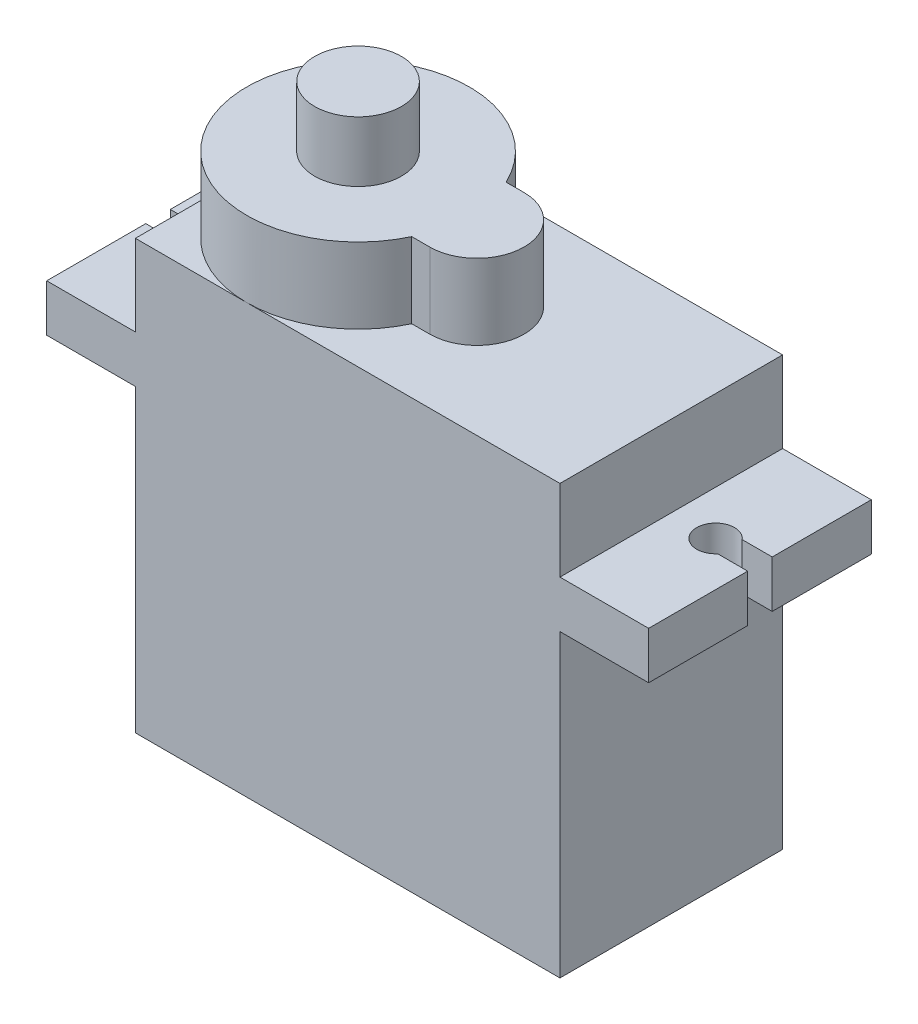
ISO-10303-21;
HEADER;
FILE_DESCRIPTION(('STEP AP214'),'2;1');
FILE_NAME('part.step','',(''),(''),'','','');
FILE_SCHEMA(('AUTOMOTIVE_DESIGN { 1 0 10303 214 1 1 1 1 }'));
ENDSEC;
DATA;
#1=APPLICATION_CONTEXT('core data for automotive mechanical design processes');
#2=APPLICATION_PROTOCOL_DEFINITION('international standard','automotive_design',2000,#1);
#3=PRODUCT_CONTEXT('',#1,'mechanical');
#4=PRODUCT('Part','Part','',(#3));
#5=PRODUCT_RELATED_PRODUCT_CATEGORY('part','',(#4));
#6=PRODUCT_DEFINITION_FORMATION('','',#4);
#7=PRODUCT_DEFINITION_CONTEXT('part definition',#1,'design');
#8=PRODUCT_DEFINITION('design','',#6,#7);
#9=PRODUCT_DEFINITION_SHAPE('','',#8);
#10=(LENGTH_UNIT() NAMED_UNIT(*) SI_UNIT(.MILLI.,.METRE.));
#11=(NAMED_UNIT(*) PLANE_ANGLE_UNIT() SI_UNIT($,.RADIAN.));
#12=(NAMED_UNIT(*) SI_UNIT($,.STERADIAN.) SOLID_ANGLE_UNIT());
#13=UNCERTAINTY_MEASURE_WITH_UNIT(LENGTH_MEASURE(1.E-05),#10,'distance_accuracy_value','');
#14=(GEOMETRIC_REPRESENTATION_CONTEXT(3) GLOBAL_UNCERTAINTY_ASSIGNED_CONTEXT((#13)) GLOBAL_UNIT_ASSIGNED_CONTEXT((#10,
#11,#12)) REPRESENTATION_CONTEXT('',''));
#15=CARTESIAN_POINT('',(0.,0.,0.));
#16=DIRECTION('',(0.,0.,1.));
#17=DIRECTION('',(1.,0.,0.));
#18=AXIS2_PLACEMENT_3D('',#15,#16,#17);
#19=CARTESIAN_POINT('',(5.9,29.9,5.9));
#20=DIRECTION('',(0.,-1.,0.));
#21=DIRECTION('',(0.,0.,-1.));
#22=AXIS2_PLACEMENT_3D('',#19,#20,#21);
#23=CYLINDRICAL_SURFACE('',#22,2.3);
#24=CARTESIAN_POINT('',(5.9,29.9,5.9));
#25=DIRECTION('',(0.,1.,0.));
#26=DIRECTION('',(0.,0.,1.));
#27=AXIS2_PLACEMENT_3D('',#24,#25,#26);
#28=CIRCLE('',#27,2.3);
#29=CARTESIAN_POINT('',(5.9,29.9,8.2));
#30=VERTEX_POINT('',#29);
#31=EDGE_CURVE('E11',#30,#30,#28,.T.);
#32=ORIENTED_EDGE('',*,*,#31,.F.);
#33=EDGE_LOOP('',(#32));
#34=FACE_BOUND('',#33,.T.);
#35=CARTESIAN_POINT('',(5.9,26.7,5.9));
#36=DIRECTION('',(0.,1.,0.));
#37=DIRECTION('',(0.,0.,1.));
#38=AXIS2_PLACEMENT_3D('',#35,#36,#37);
#39=CIRCLE('',#38,2.3);
#40=CARTESIAN_POINT('',(5.9,26.7,8.2));
#41=VERTEX_POINT('',#40);
#42=EDGE_CURVE('E50',#41,#41,#39,.T.);
#43=ORIENTED_EDGE('',*,*,#42,.T.);
#44=EDGE_LOOP('',(#43));
#45=FACE_BOUND('',#44,.T.);
#46=ADVANCED_FACE('F47',(#34,#45),#23,.T.);
#47=CARTESIAN_POINT('',(5.9,29.9,5.9));
#48=DIRECTION('',(0.,1.,0.));
#49=DIRECTION('',(0.,0.,1.));
#50=AXIS2_PLACEMENT_3D('',#47,#48,#49);
#51=PLANE('',#50);
#52=ORIENTED_EDGE('',*,*,#31,.T.);
#53=EDGE_LOOP('',(#52));
#54=FACE_BOUND('',#53,.T.);
#55=ADVANCED_FACE('F62',(#54),#51,.T.);
#56=CARTESIAN_POINT('',(5.9,26.7,5.9));
#57=DIRECTION('',(0.,1.,0.));
#58=DIRECTION('',(0.,0.,1.));
#59=AXIS2_PLACEMENT_3D('',#56,#57,#58);
#60=PLANE('',#59);
#61=ORIENTED_EDGE('',*,*,#42,.F.);
#62=EDGE_LOOP('',(#61));
#63=FACE_BOUND('',#62,.T.);
#64=ADVANCED_FACE('F60',(#63),#60,.F.);
#65=CLOSED_SHELL('',(#46,#55,#64));
#66=MANIFOLD_SOLID_BREP('B2',#65);
#67=CARTESIAN_POINT('',(22.5,15.9,11.8));
#68=DIRECTION('',(0.,1.,0.));
#69=DIRECTION('',(-1.,0.,0.));
#70=AXIS2_PLACEMENT_3D('',#67,#68,#69);
#71=PLANE('',#70);
#72=DIRECTION('',(1.,0.,0.));
#73=VECTOR('',#72,1.);
#74=CARTESIAN_POINT('',(22.5,15.9,5.25));
#75=LINE('',#74,#73);
#76=CARTESIAN_POINT('',(25.6099342076785,15.9,5.25));
#77=VERTEX_POINT('',#76);
#78=CARTESIAN_POINT('',(27.2,15.9,5.25));
#79=VERTEX_POINT('',#78);
#80=EDGE_CURVE('E505',#77,#79,#75,.T.);
#81=ORIENTED_EDGE('',*,*,#80,.F.);
#82=CARTESIAN_POINT('',(24.85,15.9,5.9));
#83=DIRECTION('',(0.,1.,0.));
#84=DIRECTION('',(-1.,0.,0.));
#85=AXIS2_PLACEMENT_3D('',#82,#83,#84);
#86=CIRCLE('',#85,1.);
#87=CARTESIAN_POINT('',(25.6099342076785,15.9,6.55));
#88=VERTEX_POINT('',#87);
#89=EDGE_CURVE('E504',#88,#77,#86,.F.);
#90=ORIENTED_EDGE('',*,*,#89,.F.);
#91=DIRECTION('',(-1.,0.,0.));
#92=VECTOR('',#91,1.);
#93=CARTESIAN_POINT('',(22.5,15.9,6.55));
#94=LINE('',#93,#92);
#95=CARTESIAN_POINT('',(27.2,15.9,6.55));
#96=VERTEX_POINT('',#95);
#97=EDGE_CURVE('E503',#96,#88,#94,.T.);
#98=ORIENTED_EDGE('',*,*,#97,.F.);
#99=DIRECTION('',(0.,0.,-1.));
#100=VECTOR('',#99,1.);
#101=CARTESIAN_POINT('',(27.2,15.9,11.8));
#102=LINE('',#101,#100);
#103=CARTESIAN_POINT('',(27.2,15.9,11.8));
#104=VERTEX_POINT('',#103);
#105=EDGE_CURVE('E282',#104,#96,#102,.T.);
#106=ORIENTED_EDGE('',*,*,#105,.F.);
#107=DIRECTION('',(1.,0.,0.));
#108=VECTOR('',#107,1.);
#109=CARTESIAN_POINT('',(22.5,15.9,11.8));
#110=LINE('',#109,#108);
#111=CARTESIAN_POINT('',(22.5,15.9,11.8));
#112=VERTEX_POINT('',#111);
#113=EDGE_CURVE('E384',#112,#104,#110,.T.);
#114=ORIENTED_EDGE('',*,*,#113,.F.);
#115=DIRECTION('',(0.,0.,-1.));
#116=VECTOR('',#115,1.);
#117=CARTESIAN_POINT('',(22.5,15.9,11.8));
#118=LINE('',#117,#116);
#119=CARTESIAN_POINT('',(22.5,15.9,0.));
#120=VERTEX_POINT('',#119);
#121=EDGE_CURVE('E297',#112,#120,#118,.T.);
#122=ORIENTED_EDGE('',*,*,#121,.T.);
#123=DIRECTION('',(1.,0.,0.));
#124=VECTOR('',#123,1.);
#125=CARTESIAN_POINT('',(22.5,15.9,0.));
#126=LINE('',#125,#124);
#127=CARTESIAN_POINT('',(27.2,15.9,0.));
#128=VERTEX_POINT('',#127);
#129=EDGE_CURVE('E410',#120,#128,#126,.T.);
#130=ORIENTED_EDGE('',*,*,#129,.T.);
#131=EDGE_CURVE('E289',#79,#128,#102,.T.);
#132=ORIENTED_EDGE('',*,*,#131,.F.);
#133=EDGE_LOOP('',(#81,#90,#98,#106,#114,#122,#130,#132));
#134=FACE_BOUND('',#133,.T.);
#135=ADVANCED_FACE('F94',(#134),#71,.F.);
#136=CARTESIAN_POINT('',(27.2,15.9,11.8));
#137=DIRECTION('',(-1.,0.,0.));
#138=DIRECTION('',(0.,-1.,0.));
#139=AXIS2_PLACEMENT_3D('',#136,#137,#138);
#140=PLANE('',#139);
#141=DIRECTION('',(0.,1.,0.));
#142=VECTOR('',#141,1.);
#143=CARTESIAN_POINT('',(27.2,14.4,5.25));
#144=LINE('',#143,#142);
#145=CARTESIAN_POINT('',(27.2,18.4,5.25));
#146=VERTEX_POINT('',#145);
#147=EDGE_CURVE('E283',#79,#146,#144,.T.);
#148=ORIENTED_EDGE('',*,*,#147,.F.);
#149=ORIENTED_EDGE('',*,*,#131,.T.);
#150=DIRECTION('',(0.,1.,0.));
#151=VECTOR('',#150,1.);
#152=CARTESIAN_POINT('',(27.2,15.9,0.));
#153=LINE('',#152,#151);
#154=CARTESIAN_POINT('',(27.2,18.4,0.));
#155=VERTEX_POINT('',#154);
#156=EDGE_CURVE('E413',#128,#155,#153,.T.);
#157=ORIENTED_EDGE('',*,*,#156,.T.);
#158=DIRECTION('',(0.,0.,-1.));
#159=VECTOR('',#158,1.);
#160=CARTESIAN_POINT('',(27.2,18.4,11.8));
#161=LINE('',#160,#159);
#162=EDGE_CURVE('E290',#146,#155,#161,.T.);
#163=ORIENTED_EDGE('',*,*,#162,.F.);
#164=EDGE_LOOP('',(#148,#149,#157,#163));
#165=FACE_BOUND('',#164,.T.);
#166=ADVANCED_FACE('F553',(#165),#140,.F.);
#167=DIRECTION('',(0.,1.,0.));
#168=VECTOR('',#167,1.);
#169=CARTESIAN_POINT('',(27.2,14.4,6.55));
#170=LINE('',#169,#168);
#171=CARTESIAN_POINT('',(27.2,18.4,6.55));
#172=VERTEX_POINT('',#171);
#173=EDGE_CURVE('E267',#96,#172,#170,.T.);
#174=ORIENTED_EDGE('',*,*,#173,.T.);
#175=CARTESIAN_POINT('',(27.2,18.4,11.8));
#176=VERTEX_POINT('',#175);
#177=EDGE_CURVE('E279',#176,#172,#161,.T.);
#178=ORIENTED_EDGE('',*,*,#177,.F.);
#179=DIRECTION('',(0.,1.,0.));
#180=VECTOR('',#179,1.);
#181=CARTESIAN_POINT('',(27.2,15.9,11.8));
#182=LINE('',#181,#180);
#183=EDGE_CURVE('E386',#104,#176,#182,.T.);
#184=ORIENTED_EDGE('',*,*,#183,.F.);
#185=ORIENTED_EDGE('',*,*,#105,.T.);
#186=EDGE_LOOP('',(#174,#178,#184,#185));
#187=FACE_BOUND('',#186,.T.);
#188=ADVANCED_FACE('F277',(#187),#140,.F.);
#189=CARTESIAN_POINT('',(22.5,18.4,11.8));
#190=DIRECTION('',(0.,-1.,0.));
#191=DIRECTION('',(0.,0.,-1.));
#192=AXIS2_PLACEMENT_3D('',#189,#190,#191);
#193=PLANE('',#192);
#194=DIRECTION('',(1.,0.,0.));
#195=VECTOR('',#194,1.);
#196=CARTESIAN_POINT('',(27.2,18.4,5.25));
#197=LINE('',#196,#195);
#198=CARTESIAN_POINT('',(25.6099342076785,18.4,5.25));
#199=VERTEX_POINT('',#198);
#200=EDGE_CURVE('E272',#199,#146,#197,.T.);
#201=ORIENTED_EDGE('',*,*,#200,.T.);
#202=ORIENTED_EDGE('',*,*,#162,.T.);
#203=DIRECTION('',(-1.,0.,0.));
#204=VECTOR('',#203,1.);
#205=CARTESIAN_POINT('',(22.5,18.4,0.));
#206=LINE('',#205,#204);
#207=CARTESIAN_POINT('',(22.5,18.4,0.));
#208=VERTEX_POINT('',#207);
#209=EDGE_CURVE('E416',#155,#208,#206,.T.);
#210=ORIENTED_EDGE('',*,*,#209,.T.);
#211=DIRECTION('',(0.,0.,-1.));
#212=VECTOR('',#211,1.);
#213=CARTESIAN_POINT('',(22.5,18.4,11.8));
#214=LINE('',#213,#212);
#215=CARTESIAN_POINT('',(22.5,18.4,11.8));
#216=VERTEX_POINT('',#215);
#217=EDGE_CURVE('E293',#216,#208,#214,.T.);
#218=ORIENTED_EDGE('',*,*,#217,.F.);
#219=DIRECTION('',(-1.,0.,0.));
#220=VECTOR('',#219,1.);
#221=CARTESIAN_POINT('',(22.5,18.4,11.8));
#222=LINE('',#221,#220);
#223=EDGE_CURVE('E288',#176,#216,#222,.T.);
#224=ORIENTED_EDGE('',*,*,#223,.F.);
#225=ORIENTED_EDGE('',*,*,#177,.T.);
#226=DIRECTION('',(-1.,0.,0.));
#227=VECTOR('',#226,1.);
#228=CARTESIAN_POINT('',(27.2,18.4,6.55));
#229=LINE('',#228,#227);
#230=CARTESIAN_POINT('',(25.6099342076785,18.4,6.55));
#231=VERTEX_POINT('',#230);
#232=EDGE_CURVE('E264',#172,#231,#229,.T.);
#233=ORIENTED_EDGE('',*,*,#232,.T.);
#234=CARTESIAN_POINT('',(24.85,18.4,5.9));
#235=DIRECTION('',(0.,-1.,0.));
#236=DIRECTION('',(0.,0.,1.));
#237=AXIS2_PLACEMENT_3D('',#234,#235,#236);
#238=CIRCLE('',#237,1.);
#239=EDGE_CURVE('E109',#231,#199,#238,.T.);
#240=ORIENTED_EDGE('',*,*,#239,.T.);
#241=EDGE_LOOP('',(#201,#202,#210,#218,#224,#225,#233,#240));
#242=FACE_BOUND('',#241,.T.);
#243=ADVANCED_FACE('F286',(#242),#193,.F.);
#244=CARTESIAN_POINT('',(-4.7,15.9,11.8));
#245=DIRECTION('',(1.,0.,0.));
#246=DIRECTION('',(0.,0.,-1.));
#247=AXIS2_PLACEMENT_3D('',#244,#245,#246);
#248=PLANE('',#247);
#249=DIRECTION('',(0.,0.,-1.));
#250=VECTOR('',#249,1.);
#251=CARTESIAN_POINT('',(-4.7,18.4,11.8));
#252=LINE('',#251,#250);
#253=CARTESIAN_POINT('',(-4.7,18.4,11.8));
#254=VERTEX_POINT('',#253);
#255=CARTESIAN_POINT('',(-4.7,18.4,6.55));
#256=VERTEX_POINT('',#255);
#257=EDGE_CURVE('E439',#254,#256,#252,.T.);
#258=ORIENTED_EDGE('',*,*,#257,.T.);
#259=DIRECTION('',(0.,1.,0.));
#260=VECTOR('',#259,1.);
#261=CARTESIAN_POINT('',(-4.7,14.4,6.55));
#262=LINE('',#261,#260);
#263=CARTESIAN_POINT('',(-4.7,15.9,6.55));
#264=VERTEX_POINT('',#263);
#265=EDGE_CURVE('E329',#264,#256,#262,.T.);
#266=ORIENTED_EDGE('',*,*,#265,.F.);
#267=DIRECTION('',(0.,0.,-1.));
#268=VECTOR('',#267,1.);
#269=CARTESIAN_POINT('',(-4.7,15.9,11.8));
#270=LINE('',#269,#268);
#271=CARTESIAN_POINT('',(-4.7,15.9,11.8));
#272=VERTEX_POINT('',#271);
#273=EDGE_CURVE('E436',#272,#264,#270,.T.);
#274=ORIENTED_EDGE('',*,*,#273,.F.);
#275=DIRECTION('',(0.,-1.,0.));
#276=VECTOR('',#275,1.);
#277=CARTESIAN_POINT('',(-4.7,15.9,11.8));
#278=LINE('',#277,#276);
#279=EDGE_CURVE('E399',#254,#272,#278,.T.);
#280=ORIENTED_EDGE('',*,*,#279,.F.);
#281=EDGE_LOOP('',(#258,#266,#274,#280));
#282=FACE_BOUND('',#281,.T.);
#283=ADVANCED_FACE('F536',(#282),#248,.F.);
#284=CARTESIAN_POINT('',(0.,22.7,11.8));
#285=DIRECTION('',(0.,-1.,0.));
#286=DIRECTION('',(0.,0.,-1.));
#287=AXIS2_PLACEMENT_3D('',#284,#285,#286);
#288=PLANE('',#287);
#289=CARTESIAN_POINT('',(5.9,22.7,5.9));
#290=DIRECTION('',(0.,1.,0.));
#291=DIRECTION('',(0.,0.,1.));
#292=AXIS2_PLACEMENT_3D('',#289,#290,#291);
#293=CIRCLE('',#292,5.9);
#294=CARTESIAN_POINT('',(0.,22.7,5.9));
#295=VERTEX_POINT('',#294);
#296=CARTESIAN_POINT('',(5.9,22.7,11.8));
#297=VERTEX_POINT('',#296);
#298=EDGE_CURVE('E308',#295,#297,#293,.T.);
#299=ORIENTED_EDGE('',*,*,#298,.F.);
#300=DIRECTION('',(0.,0.,-1.));
#301=VECTOR('',#300,1.);
#302=CARTESIAN_POINT('',(0.,22.7,11.8));
#303=LINE('',#302,#301);
#304=CARTESIAN_POINT('',(0.,22.7,11.8));
#305=VERTEX_POINT('',#304);
#306=EDGE_CURVE('E446',#305,#295,#303,.T.);
#307=ORIENTED_EDGE('',*,*,#306,.F.);
#308=DIRECTION('',(-1.,0.,0.));
#309=VECTOR('',#308,1.);
#310=CARTESIAN_POINT('',(0.,22.7,11.8));
#311=LINE('',#310,#309);
#312=EDGE_CURVE('E391',#297,#305,#311,.T.);
#313=ORIENTED_EDGE('',*,*,#312,.F.);
#314=EDGE_LOOP('',(#299,#307,#313));
#315=FACE_BOUND('',#314,.T.);
#316=ADVANCED_FACE('F492',(#315),#288,.F.);
#317=CARTESIAN_POINT('',(11.244155686355,22.7,8.4));
#318=VERTEX_POINT('',#317);
#319=EDGE_CURVE('E488',#297,#318,#293,.T.);
#320=ORIENTED_EDGE('',*,*,#319,.F.);
#321=CARTESIAN_POINT('',(22.5,22.7,11.8));
#322=VERTEX_POINT('',#321);
#323=EDGE_CURVE('E392',#322,#297,#311,.T.);
#324=ORIENTED_EDGE('',*,*,#323,.F.);
#325=DIRECTION('',(0.,0.,-1.));
#326=VECTOR('',#325,1.);
#327=CARTESIAN_POINT('',(22.5,22.7,11.8));
#328=LINE('',#327,#326);
#329=CARTESIAN_POINT('',(22.5,22.7,0.));
#330=VERTEX_POINT('',#329);
#331=EDGE_CURVE('E448',#322,#330,#328,.T.);
#332=ORIENTED_EDGE('',*,*,#331,.T.);
#333=DIRECTION('',(-1.,0.,0.));
#334=VECTOR('',#333,1.);
#335=CARTESIAN_POINT('',(0.,22.7,0.));
#336=LINE('',#335,#334);
#337=CARTESIAN_POINT('',(5.9,22.7,0.));
#338=VERTEX_POINT('',#337);
#339=EDGE_CURVE('E421',#330,#338,#336,.T.);
#340=ORIENTED_EDGE('',*,*,#339,.T.);
#341=CARTESIAN_POINT('',(11.244155686355,22.7,3.4));
#342=VERTEX_POINT('',#341);
#343=EDGE_CURVE('E359',#342,#338,#293,.T.);
#344=ORIENTED_EDGE('',*,*,#343,.F.);
#345=DIRECTION('',(-1.,0.,0.));
#346=VECTOR('',#345,1.);
#347=CARTESIAN_POINT('',(12.2,22.7,3.4));
#348=LINE('',#347,#346);
#349=CARTESIAN_POINT('',(12.2,22.7,3.4));
#350=VERTEX_POINT('',#349);
#351=EDGE_CURVE('E356',#350,#342,#348,.T.);
#352=ORIENTED_EDGE('',*,*,#351,.F.);
#353=CARTESIAN_POINT('',(12.2,22.7,5.9));
#354=DIRECTION('',(0.,1.,0.));
#355=DIRECTION('',(0.,0.,1.));
#356=AXIS2_PLACEMENT_3D('',#353,#354,#355);
#357=CIRCLE('',#356,2.5);
#358=CARTESIAN_POINT('',(12.2,22.7,8.4));
#359=VERTEX_POINT('',#358);
#360=EDGE_CURVE('E341',#359,#350,#357,.T.);
#361=ORIENTED_EDGE('',*,*,#360,.F.);
#362=DIRECTION('',(1.,0.,0.));
#363=VECTOR('',#362,1.);
#364=CARTESIAN_POINT('',(12.2,22.7,8.4));
#365=LINE('',#364,#363);
#366=EDGE_CURVE('E347',#318,#359,#365,.T.);
#367=ORIENTED_EDGE('',*,*,#366,.F.);
#368=EDGE_LOOP('',(#320,#324,#332,#340,#344,#352,#361,#367));
#369=FACE_BOUND('',#368,.T.);
#370=ADVANCED_FACE('F467',(#369),#288,.F.);
#371=EDGE_CURVE('E306',#338,#295,#293,.T.);
#372=ORIENTED_EDGE('',*,*,#371,.F.);
#373=CARTESIAN_POINT('',(0.,22.7,0.));
#374=VERTEX_POINT('',#373);
#375=EDGE_CURVE('E420',#338,#374,#336,.T.);
#376=ORIENTED_EDGE('',*,*,#375,.T.);
#377=EDGE_CURVE('E445',#295,#374,#303,.T.);
#378=ORIENTED_EDGE('',*,*,#377,.F.);
#379=EDGE_LOOP('',(#372,#376,#378));
#380=FACE_BOUND('',#379,.T.);
#381=ADVANCED_FACE('F541',(#380),#288,.F.);
#382=CARTESIAN_POINT('',(0.,0.,11.8));
#383=DIRECTION('',(1.,0.,0.));
#384=DIRECTION('',(0.,0.,-1.));
#385=AXIS2_PLACEMENT_3D('',#382,#383,#384);
#386=PLANE('',#385);
#387=DIRECTION('',(0.,-1.,0.));
#388=VECTOR('',#387,1.);
#389=CARTESIAN_POINT('',(0.,0.,0.));
#390=LINE('',#389,#388);
#391=CARTESIAN_POINT('',(0.,15.9,0.));
#392=VERTEX_POINT('',#391);
#393=CARTESIAN_POINT('',(0.,0.,0.));
#394=VERTEX_POINT('',#393);
#395=EDGE_CURVE('E375',#392,#394,#390,.T.);
#396=ORIENTED_EDGE('',*,*,#395,.T.);
#397=DIRECTION('',(0.,0.,-1.));
#398=VECTOR('',#397,1.);
#399=CARTESIAN_POINT('',(0.,0.,11.8));
#400=LINE('',#399,#398);
#401=CARTESIAN_POINT('',(0.,0.,11.8));
#402=VERTEX_POINT('',#401);
#403=EDGE_CURVE('E303',#402,#394,#400,.T.);
#404=ORIENTED_EDGE('',*,*,#403,.F.);
#405=DIRECTION('',(0.,-1.,0.));
#406=VECTOR('',#405,1.);
#407=CARTESIAN_POINT('',(0.,0.,11.8));
#408=LINE('',#407,#406);
#409=CARTESIAN_POINT('',(0.,15.9,11.8));
#410=VERTEX_POINT('',#409);
#411=EDGE_CURVE('E376',#410,#402,#408,.T.);
#412=ORIENTED_EDGE('',*,*,#411,.F.);
#413=DIRECTION('',(0.,0.,-1.));
#414=VECTOR('',#413,1.);
#415=CARTESIAN_POINT('',(0.,15.9,11.8));
#416=LINE('',#415,#414);
#417=EDGE_CURVE('E403',#410,#392,#416,.T.);
#418=ORIENTED_EDGE('',*,*,#417,.T.);
#419=EDGE_LOOP('',(#396,#404,#412,#418));
#420=FACE_BOUND('',#419,.T.);
#421=ADVANCED_FACE('F96',(#420),#386,.F.);
#422=CARTESIAN_POINT('',(0.,0.,11.8));
#423=DIRECTION('',(0.,1.,0.));
#424=DIRECTION('',(0.,0.,1.));
#425=AXIS2_PLACEMENT_3D('',#422,#423,#424);
#426=PLANE('',#425);
#427=DIRECTION('',(1.,0.,0.));
#428=VECTOR('',#427,1.);
#429=CARTESIAN_POINT('',(0.,0.,0.));
#430=LINE('',#429,#428);
#431=CARTESIAN_POINT('',(22.5,0.,0.));
#432=VERTEX_POINT('',#431);
#433=EDGE_CURVE('E406',#394,#432,#430,.T.);
#434=ORIENTED_EDGE('',*,*,#433,.T.);
#435=DIRECTION('',(0.,0.,-1.));
#436=VECTOR('',#435,1.);
#437=CARTESIAN_POINT('',(22.5,0.,11.8));
#438=LINE('',#437,#436);
#439=CARTESIAN_POINT('',(22.5,0.,11.8));
#440=VERTEX_POINT('',#439);
#441=EDGE_CURVE('E300',#440,#432,#438,.T.);
#442=ORIENTED_EDGE('',*,*,#441,.F.);
#443=DIRECTION('',(1.,0.,0.));
#444=VECTOR('',#443,1.);
#445=CARTESIAN_POINT('',(0.,0.,11.8));
#446=LINE('',#445,#444);
#447=EDGE_CURVE('E379',#402,#440,#446,.T.);
#448=ORIENTED_EDGE('',*,*,#447,.F.);
#449=ORIENTED_EDGE('',*,*,#403,.T.);
#450=EDGE_LOOP('',(#434,#442,#448,#449));
#451=FACE_BOUND('',#450,.T.);
#452=ADVANCED_FACE('F548',(#451),#426,.F.);
#453=CARTESIAN_POINT('',(22.5,0.,11.8));
#454=DIRECTION('',(-1.,0.,0.));
#455=DIRECTION('',(0.,0.,1.));
#456=AXIS2_PLACEMENT_3D('',#453,#454,#455);
#457=PLANE('',#456);
#458=DIRECTION('',(0.,1.,0.));
#459=VECTOR('',#458,1.);
#460=CARTESIAN_POINT('',(22.5,0.,0.));
#461=LINE('',#460,#459);
#462=EDGE_CURVE('E408',#432,#120,#461,.T.);
#463=ORIENTED_EDGE('',*,*,#462,.T.);
#464=ORIENTED_EDGE('',*,*,#121,.F.);
#465=DIRECTION('',(0.,1.,0.));
#466=VECTOR('',#465,1.);
#467=CARTESIAN_POINT('',(22.5,0.,11.8));
#468=LINE('',#467,#466);
#469=EDGE_CURVE('E382',#440,#112,#468,.T.);
#470=ORIENTED_EDGE('',*,*,#469,.F.);
#471=ORIENTED_EDGE('',*,*,#441,.T.);
#472=EDGE_LOOP('',(#463,#464,#470,#471));
#473=FACE_BOUND('',#472,.T.);
#474=ADVANCED_FACE('F562',(#473),#457,.F.);
#475=CARTESIAN_POINT('',(22.5,18.4,11.8));
#476=DIRECTION('',(-1.,0.,0.));
#477=DIRECTION('',(0.,0.,1.));
#478=AXIS2_PLACEMENT_3D('',#475,#476,#477);
#479=PLANE('',#478);
#480=DIRECTION('',(0.,1.,0.));
#481=VECTOR('',#480,1.);
#482=CARTESIAN_POINT('',(22.5,18.4,0.));
#483=LINE('',#482,#481);
#484=EDGE_CURVE('E418',#208,#330,#483,.T.);
#485=ORIENTED_EDGE('',*,*,#484,.T.);
#486=ORIENTED_EDGE('',*,*,#331,.F.);
#487=DIRECTION('',(0.,1.,0.));
#488=VECTOR('',#487,1.);
#489=CARTESIAN_POINT('',(22.5,18.4,11.8));
#490=LINE('',#489,#488);
#491=EDGE_CURVE('E389',#216,#322,#490,.T.);
#492=ORIENTED_EDGE('',*,*,#491,.F.);
#493=ORIENTED_EDGE('',*,*,#217,.T.);
#494=EDGE_LOOP('',(#485,#486,#492,#493));
#495=FACE_BOUND('',#494,.T.);
#496=ADVANCED_FACE('F458',(#495),#479,.F.);
#497=CARTESIAN_POINT('',(0.,18.4,11.8));
#498=DIRECTION('',(1.,0.,0.));
#499=DIRECTION('',(0.,0.,-1.));
#500=AXIS2_PLACEMENT_3D('',#497,#498,#499);
#501=PLANE('',#500);
#502=DIRECTION('',(0.,-1.,0.));
#503=VECTOR('',#502,1.);
#504=CARTESIAN_POINT('',(0.,18.4,0.));
#505=LINE('',#504,#503);
#506=CARTESIAN_POINT('',(0.,18.4,0.));
#507=VERTEX_POINT('',#506);
#508=EDGE_CURVE('E424',#374,#507,#505,.T.);
#509=ORIENTED_EDGE('',*,*,#508,.T.);
#510=DIRECTION('',(0.,0.,-1.));
#511=VECTOR('',#510,1.);
#512=CARTESIAN_POINT('',(0.,18.4,11.8));
#513=LINE('',#512,#511);
#514=CARTESIAN_POINT('',(0.,18.4,11.8));
#515=VERTEX_POINT('',#514);
#516=EDGE_CURVE('E442',#515,#507,#513,.T.);
#517=ORIENTED_EDGE('',*,*,#516,.F.);
#518=DIRECTION('',(0.,-1.,0.));
#519=VECTOR('',#518,1.);
#520=CARTESIAN_POINT('',(0.,18.4,11.8));
#521=LINE('',#520,#519);
#522=EDGE_CURVE('E395',#305,#515,#521,.T.);
#523=ORIENTED_EDGE('',*,*,#522,.F.);
#524=ORIENTED_EDGE('',*,*,#306,.T.);
#525=ORIENTED_EDGE('',*,*,#377,.T.);
#526=EDGE_LOOP('',(#509,#517,#523,#524,#525));
#527=FACE_BOUND('',#526,.T.);
#528=ADVANCED_FACE('F539',(#527),#501,.F.);
#529=CARTESIAN_POINT('',(-4.7,18.4,11.8));
#530=DIRECTION('',(0.,-1.,0.));
#531=DIRECTION('',(0.,0.,-1.));
#532=AXIS2_PLACEMENT_3D('',#529,#530,#531);
#533=PLANE('',#532);
#534=CARTESIAN_POINT('',(-2.35,18.4,5.9));
#535=DIRECTION('',(0.,1.,0.));
#536=DIRECTION('',(0.,0.,1.));
#537=AXIS2_PLACEMENT_3D('',#534,#535,#536);
#538=CIRCLE('',#537,1.);
#539=CARTESIAN_POINT('',(-3.10993420767853,18.4,6.55));
#540=VERTEX_POINT('',#539);
#541=CARTESIAN_POINT('',(-3.10993420767853,18.4,5.25));
#542=VERTEX_POINT('',#541);
#543=EDGE_CURVE('E513',#540,#542,#538,.T.);
#544=ORIENTED_EDGE('',*,*,#543,.F.);
#545=DIRECTION('',(1.,0.,0.));
#546=VECTOR('',#545,1.);
#547=CARTESIAN_POINT('',(-4.7,18.4,6.55));
#548=LINE('',#547,#546);
#549=EDGE_CURVE('E326',#256,#540,#548,.T.);
#550=ORIENTED_EDGE('',*,*,#549,.F.);
#551=ORIENTED_EDGE('',*,*,#257,.F.);
#552=DIRECTION('',(-1.,0.,0.));
#553=VECTOR('',#552,1.);
#554=CARTESIAN_POINT('',(-4.7,18.4,11.8));
#555=LINE('',#554,#553);
#556=EDGE_CURVE('E397',#515,#254,#555,.T.);
#557=ORIENTED_EDGE('',*,*,#556,.F.);
#558=ORIENTED_EDGE('',*,*,#516,.T.);
#559=DIRECTION('',(-1.,0.,0.));
#560=VECTOR('',#559,1.);
#561=CARTESIAN_POINT('',(-4.7,18.4,0.));
#562=LINE('',#561,#560);
#563=CARTESIAN_POINT('',(-4.7,18.4,0.));
#564=VERTEX_POINT('',#563);
#565=EDGE_CURVE('E426',#507,#564,#562,.T.);
#566=ORIENTED_EDGE('',*,*,#565,.T.);
#567=CARTESIAN_POINT('',(-4.7,18.4,5.25));
#568=VERTEX_POINT('',#567);
#569=EDGE_CURVE('E438',#568,#564,#252,.T.);
#570=ORIENTED_EDGE('',*,*,#569,.F.);
#571=DIRECTION('',(-1.,0.,0.));
#572=VECTOR('',#571,1.);
#573=CARTESIAN_POINT('',(-4.7,18.4,5.25));
#574=LINE('',#573,#572);
#575=EDGE_CURVE('E514',#542,#568,#574,.T.);
#576=ORIENTED_EDGE('',*,*,#575,.F.);
#577=EDGE_LOOP('',(#544,#550,#551,#557,#558,#566,#570,#576));
#578=FACE_BOUND('',#577,.T.);
#579=ADVANCED_FACE('F521',(#578),#533,.F.);
#580=CARTESIAN_POINT('',(-4.7,15.9,5.25));
#581=VERTEX_POINT('',#580);
#582=CARTESIAN_POINT('',(-4.7,15.9,0.));
#583=VERTEX_POINT('',#582);
#584=EDGE_CURVE('E435',#581,#583,#270,.T.);
#585=ORIENTED_EDGE('',*,*,#584,.F.);
#586=DIRECTION('',(0.,1.,0.));
#587=VECTOR('',#586,1.);
#588=CARTESIAN_POINT('',(-4.7,14.4,5.25));
#589=LINE('',#588,#587);
#590=EDGE_CURVE('E117',#581,#568,#589,.T.);
#591=ORIENTED_EDGE('',*,*,#590,.T.);
#592=ORIENTED_EDGE('',*,*,#569,.T.);
#593=DIRECTION('',(0.,-1.,0.));
#594=VECTOR('',#593,1.);
#595=CARTESIAN_POINT('',(-4.7,15.9,0.));
#596=LINE('',#595,#594);
#597=EDGE_CURVE('E429',#564,#583,#596,.T.);
#598=ORIENTED_EDGE('',*,*,#597,.T.);
#599=EDGE_LOOP('',(#585,#591,#592,#598));
#600=FACE_BOUND('',#599,.T.);
#601=ADVANCED_FACE('F520',(#600),#248,.F.);
#602=CARTESIAN_POINT('',(-4.7,15.9,11.8));
#603=DIRECTION('',(0.,1.,0.));
#604=DIRECTION('',(0.,0.,1.));
#605=AXIS2_PLACEMENT_3D('',#602,#603,#604);
#606=PLANE('',#605);
#607=ORIENTED_EDGE('',*,*,#273,.T.);
#608=DIRECTION('',(1.,0.,0.));
#609=VECTOR('',#608,1.);
#610=CARTESIAN_POINT('',(-4.7,15.9,6.55));
#611=LINE('',#610,#609);
#612=CARTESIAN_POINT('',(-3.10993420767853,15.9,6.55));
#613=VERTEX_POINT('',#612);
#614=EDGE_CURVE('E45',#264,#613,#611,.T.);
#615=ORIENTED_EDGE('',*,*,#614,.T.);
#616=CARTESIAN_POINT('',(-2.35,15.9,5.9));
#617=DIRECTION('',(0.,1.,0.));
#618=DIRECTION('',(0.,0.,1.));
#619=AXIS2_PLACEMENT_3D('',#616,#617,#618);
#620=CIRCLE('',#619,1.);
#621=CARTESIAN_POINT('',(-3.10993420767853,15.9,5.25));
#622=VERTEX_POINT('',#621);
#623=EDGE_CURVE('E102',#613,#622,#620,.T.);
#624=ORIENTED_EDGE('',*,*,#623,.T.);
#625=DIRECTION('',(-1.,0.,0.));
#626=VECTOR('',#625,1.);
#627=CARTESIAN_POINT('',(-4.7,15.9,5.25));
#628=LINE('',#627,#626);
#629=EDGE_CURVE('E307',#622,#581,#628,.T.);
#630=ORIENTED_EDGE('',*,*,#629,.T.);
#631=ORIENTED_EDGE('',*,*,#584,.T.);
#632=DIRECTION('',(1.,0.,0.));
#633=VECTOR('',#632,1.);
#634=CARTESIAN_POINT('',(-4.7,15.9,0.));
#635=LINE('',#634,#633);
#636=EDGE_CURVE('E380',#583,#392,#635,.T.);
#637=ORIENTED_EDGE('',*,*,#636,.T.);
#638=ORIENTED_EDGE('',*,*,#417,.F.);
#639=DIRECTION('',(1.,0.,0.));
#640=VECTOR('',#639,1.);
#641=CARTESIAN_POINT('',(-4.7,15.9,11.8));
#642=LINE('',#641,#640);
#643=EDGE_CURVE('E401',#272,#410,#642,.T.);
#644=ORIENTED_EDGE('',*,*,#643,.F.);
#645=EDGE_LOOP('',(#607,#615,#624,#630,#631,#637,#638,#644));
#646=FACE_BOUND('',#645,.T.);
#647=ADVANCED_FACE('F312',(#646),#606,.F.);
#648=CARTESIAN_POINT('',(0.,0.,11.8));
#649=DIRECTION('',(0.,0.,-1.));
#650=DIRECTION('',(-1.,0.,0.));
#651=AXIS2_PLACEMENT_3D('',#648,#649,#650);
#652=PLANE('',#651);
#653=ORIENTED_EDGE('',*,*,#411,.T.);
#654=ORIENTED_EDGE('',*,*,#447,.T.);
#655=ORIENTED_EDGE('',*,*,#469,.T.);
#656=ORIENTED_EDGE('',*,*,#113,.T.);
#657=ORIENTED_EDGE('',*,*,#183,.T.);
#658=ORIENTED_EDGE('',*,*,#223,.T.);
#659=ORIENTED_EDGE('',*,*,#491,.T.);
#660=ORIENTED_EDGE('',*,*,#323,.T.);
#661=ORIENTED_EDGE('',*,*,#312,.T.);
#662=ORIENTED_EDGE('',*,*,#522,.T.);
#663=ORIENTED_EDGE('',*,*,#556,.T.);
#664=ORIENTED_EDGE('',*,*,#279,.T.);
#665=ORIENTED_EDGE('',*,*,#643,.T.);
#666=EDGE_LOOP('',(#653,#654,#655,#656,#657,#658,#659,#660,#661,#662,#663,#664,#665));
#667=FACE_BOUND('',#666,.T.);
#668=ADVANCED_FACE('F496',(#667),#652,.F.);
#669=CARTESIAN_POINT('',(0.,0.,0.));
#670=DIRECTION('',(0.,0.,-1.));
#671=DIRECTION('',(-1.,0.,0.));
#672=AXIS2_PLACEMENT_3D('',#669,#670,#671);
#673=PLANE('',#672);
#674=ORIENTED_EDGE('',*,*,#395,.F.);
#675=ORIENTED_EDGE('',*,*,#636,.F.);
#676=ORIENTED_EDGE('',*,*,#597,.F.);
#677=ORIENTED_EDGE('',*,*,#565,.F.);
#678=ORIENTED_EDGE('',*,*,#508,.F.);
#679=ORIENTED_EDGE('',*,*,#375,.F.);
#680=ORIENTED_EDGE('',*,*,#339,.F.);
#681=ORIENTED_EDGE('',*,*,#484,.F.);
#682=ORIENTED_EDGE('',*,*,#209,.F.);
#683=ORIENTED_EDGE('',*,*,#156,.F.);
#684=ORIENTED_EDGE('',*,*,#129,.F.);
#685=ORIENTED_EDGE('',*,*,#462,.F.);
#686=ORIENTED_EDGE('',*,*,#433,.F.);
#687=EDGE_LOOP('',(#674,#675,#676,#677,#678,#679,#680,#681,#682,#683,#684,#685,#686));
#688=FACE_BOUND('',#687,.T.);
#689=ADVANCED_FACE('F462',(#688),#673,.T.);
#690=CARTESIAN_POINT('',(12.2,26.7,5.9));
#691=DIRECTION('',(0.,-1.,0.));
#692=DIRECTION('',(0.,0.,-1.));
#693=AXIS2_PLACEMENT_3D('',#690,#691,#692);
#694=CYLINDRICAL_SURFACE('',#693,2.5);
#695=ORIENTED_EDGE('',*,*,#360,.T.);
#696=DIRECTION('',(0.,-1.,0.));
#697=VECTOR('',#696,1.);
#698=CARTESIAN_POINT('',(12.2,26.7,3.4));
#699=LINE('',#698,#697);
#700=CARTESIAN_POINT('',(12.2,26.7,3.4));
#701=VERTEX_POINT('',#700);
#702=EDGE_CURVE('E372',#701,#350,#699,.T.);
#703=ORIENTED_EDGE('',*,*,#702,.F.);
#704=CARTESIAN_POINT('',(12.2,26.7,5.9));
#705=DIRECTION('',(0.,1.,0.));
#706=DIRECTION('',(0.,0.,1.));
#707=AXIS2_PLACEMENT_3D('',#704,#705,#706);
#708=CIRCLE('',#707,2.5);
#709=CARTESIAN_POINT('',(12.2,26.7,8.4));
#710=VERTEX_POINT('',#709);
#711=EDGE_CURVE('E343',#710,#701,#708,.T.);
#712=ORIENTED_EDGE('',*,*,#711,.F.);
#713=DIRECTION('',(0.,-1.,0.));
#714=VECTOR('',#713,1.);
#715=CARTESIAN_POINT('',(12.2,26.7,8.4));
#716=LINE('',#715,#714);
#717=EDGE_CURVE('E353',#710,#359,#716,.T.);
#718=ORIENTED_EDGE('',*,*,#717,.T.);
#719=EDGE_LOOP('',(#695,#703,#712,#718));
#720=FACE_BOUND('',#719,.T.);
#721=ADVANCED_FACE('F485',(#720),#694,.T.);
#722=CARTESIAN_POINT('',(12.2,26.7,3.4));
#723=DIRECTION('',(0.,0.,1.));
#724=DIRECTION('',(1.,0.,0.));
#725=AXIS2_PLACEMENT_3D('',#722,#723,#724);
#726=PLANE('',#725);
#727=ORIENTED_EDGE('',*,*,#351,.T.);
#728=DIRECTION('',(0.,-1.,0.));
#729=VECTOR('',#728,1.);
#730=CARTESIAN_POINT('',(11.244155686355,26.7,3.4));
#731=LINE('',#730,#729);
#732=CARTESIAN_POINT('',(11.244155686355,26.7,3.4));
#733=VERTEX_POINT('',#732);
#734=EDGE_CURVE('E369',#733,#342,#731,.T.);
#735=ORIENTED_EDGE('',*,*,#734,.F.);
#736=DIRECTION('',(-1.,0.,0.));
#737=VECTOR('',#736,1.);
#738=CARTESIAN_POINT('',(12.2,26.7,3.4));
#739=LINE('',#738,#737);
#740=EDGE_CURVE('E346',#701,#733,#739,.T.);
#741=ORIENTED_EDGE('',*,*,#740,.F.);
#742=ORIENTED_EDGE('',*,*,#702,.T.);
#743=EDGE_LOOP('',(#727,#735,#741,#742));
#744=FACE_BOUND('',#743,.T.);
#745=ADVANCED_FACE('F476',(#744),#726,.F.);
#746=CARTESIAN_POINT('',(5.9,26.7,5.9));
#747=DIRECTION('',(0.,-1.,0.));
#748=DIRECTION('',(0.,0.,-1.));
#749=AXIS2_PLACEMENT_3D('',#746,#747,#748);
#750=CYLINDRICAL_SURFACE('',#749,5.9);
#751=ORIENTED_EDGE('',*,*,#343,.T.);
#752=ORIENTED_EDGE('',*,*,#371,.T.);
#753=ORIENTED_EDGE('',*,*,#298,.T.);
#754=ORIENTED_EDGE('',*,*,#319,.T.);
#755=DIRECTION('',(0.,-1.,0.));
#756=VECTOR('',#755,1.);
#757=CARTESIAN_POINT('',(11.244155686355,26.7,8.4));
#758=LINE('',#757,#756);
#759=CARTESIAN_POINT('',(11.244155686355,26.7,8.4));
#760=VERTEX_POINT('',#759);
#761=EDGE_CURVE('E366',#760,#318,#758,.T.);
#762=ORIENTED_EDGE('',*,*,#761,.F.);
#763=CARTESIAN_POINT('',(5.9,26.7,5.9));
#764=DIRECTION('',(0.,1.,0.));
#765=DIRECTION('',(0.,0.,1.));
#766=AXIS2_PLACEMENT_3D('',#763,#764,#765);
#767=CIRCLE('',#766,5.9);
#768=EDGE_CURVE('E349',#733,#760,#767,.T.);
#769=ORIENTED_EDGE('',*,*,#768,.F.);
#770=ORIENTED_EDGE('',*,*,#734,.T.);
#771=EDGE_LOOP('',(#751,#752,#753,#754,#762,#769,#770));
#772=FACE_BOUND('',#771,.T.);
#773=ADVANCED_FACE('F470',(#772),#750,.T.);
#774=CARTESIAN_POINT('',(12.2,26.7,8.4));
#775=DIRECTION('',(0.,0.,-1.));
#776=DIRECTION('',(-1.,0.,0.));
#777=AXIS2_PLACEMENT_3D('',#774,#775,#776);
#778=PLANE('',#777);
#779=ORIENTED_EDGE('',*,*,#366,.T.);
#780=ORIENTED_EDGE('',*,*,#717,.F.);
#781=DIRECTION('',(1.,0.,0.));
#782=VECTOR('',#781,1.);
#783=CARTESIAN_POINT('',(12.2,26.7,8.4));
#784=LINE('',#783,#782);
#785=EDGE_CURVE('E351',#760,#710,#784,.T.);
#786=ORIENTED_EDGE('',*,*,#785,.F.);
#787=ORIENTED_EDGE('',*,*,#761,.T.);
#788=EDGE_LOOP('',(#779,#780,#786,#787));
#789=FACE_BOUND('',#788,.T.);
#790=ADVANCED_FACE('F482',(#789),#778,.F.);
#791=CARTESIAN_POINT('',(12.2,26.7,5.9));
#792=DIRECTION('',(0.,1.,0.));
#793=DIRECTION('',(0.,0.,1.));
#794=AXIS2_PLACEMENT_3D('',#791,#792,#793);
#795=PLANE('',#794);
#796=CARTESIAN_POINT('',(5.9,26.7,5.9));
#797=DIRECTION('',(0.,1.,0.));
#798=DIRECTION('',(0.,0.,1.));
#799=AXIS2_PLACEMENT_3D('',#796,#797,#798);
#800=CIRCLE('',#799,2.3);
#801=CARTESIAN_POINT('',(5.9,26.7,8.2));
#802=VERTEX_POINT('',#801);
#803=EDGE_CURVE('E328',#802,#802,#800,.T.);
#804=ORIENTED_EDGE('',*,*,#803,.F.);
#805=EDGE_LOOP('',(#804));
#806=FACE_BOUND('',#805,.T.);
#807=ORIENTED_EDGE('',*,*,#711,.T.);
#808=ORIENTED_EDGE('',*,*,#740,.T.);
#809=ORIENTED_EDGE('',*,*,#768,.T.);
#810=ORIENTED_EDGE('',*,*,#785,.T.);
#811=EDGE_LOOP('',(#807,#808,#809,#810));
#812=FACE_BOUND('',#811,.T.);
#813=ADVANCED_FACE('F487',(#806,#812),#795,.T.);
#814=CARTESIAN_POINT('',(5.9,22.7,5.9));
#815=DIRECTION('',(0.,1.,0.));
#816=DIRECTION('',(0.,0.,1.));
#817=AXIS2_PLACEMENT_3D('',#814,#815,#816);
#818=CYLINDRICAL_SURFACE('',#817,2.3);
#819=CARTESIAN_POINT('',(5.9,22.7,5.9));
#820=DIRECTION('',(0.,1.,0.));
#821=DIRECTION('',(0.,0.,1.));
#822=AXIS2_PLACEMENT_3D('',#819,#820,#821);
#823=CIRCLE('',#822,2.3);
#824=CARTESIAN_POINT('',(5.9,22.7,8.2));
#825=VERTEX_POINT('',#824);
#826=EDGE_CURVE('E332',#825,#825,#823,.T.);
#827=ORIENTED_EDGE('',*,*,#826,.F.);
#828=EDGE_LOOP('',(#827));
#829=FACE_BOUND('',#828,.T.);
#830=ORIENTED_EDGE('',*,*,#803,.T.);
#831=EDGE_LOOP('',(#830));
#832=FACE_BOUND('',#831,.T.);
#833=ADVANCED_FACE('F599',(#829,#832),#818,.F.);
#834=CARTESIAN_POINT('',(5.9,22.7,5.9));
#835=DIRECTION('',(0.,1.,0.));
#836=DIRECTION('',(0.,0.,1.));
#837=AXIS2_PLACEMENT_3D('',#834,#835,#836);
#838=PLANE('',#837);
#839=ORIENTED_EDGE('',*,*,#826,.T.);
#840=EDGE_LOOP('',(#839));
#841=FACE_BOUND('',#840,.T.);
#842=ADVANCED_FACE('F596',(#841),#838,.T.);
#843=CARTESIAN_POINT('',(-2.35,14.4,5.9));
#844=DIRECTION('',(0.,1.,0.));
#845=DIRECTION('',(0.,0.,1.));
#846=AXIS2_PLACEMENT_3D('',#843,#844,#845);
#847=CYLINDRICAL_SURFACE('',#846,1.);
#848=DIRECTION('',(0.,1.,0.));
#849=VECTOR('',#848,1.);
#850=CARTESIAN_POINT('',(-3.10993420767853,14.4,6.55));
#851=LINE('',#850,#849);
#852=EDGE_CURVE('E319',#613,#540,#851,.T.);
#853=ORIENTED_EDGE('',*,*,#852,.T.);
#854=ORIENTED_EDGE('',*,*,#543,.T.);
#855=DIRECTION('',(0.,1.,0.));
#856=VECTOR('',#855,1.);
#857=CARTESIAN_POINT('',(-3.10993420767853,14.4,5.25));
#858=LINE('',#857,#856);
#859=EDGE_CURVE('E321',#622,#542,#858,.T.);
#860=ORIENTED_EDGE('',*,*,#859,.F.);
#861=ORIENTED_EDGE('',*,*,#623,.F.);
#862=EDGE_LOOP('',(#853,#854,#860,#861));
#863=FACE_BOUND('',#862,.T.);
#864=ADVANCED_FACE('F317',(#863),#847,.F.);
#865=CARTESIAN_POINT('',(-4.7,14.4,6.55));
#866=DIRECTION('',(0.,0.,1.));
#867=DIRECTION('',(1.,0.,0.));
#868=AXIS2_PLACEMENT_3D('',#865,#866,#867);
#869=PLANE('',#868);
#870=ORIENTED_EDGE('',*,*,#265,.T.);
#871=ORIENTED_EDGE('',*,*,#549,.T.);
#872=ORIENTED_EDGE('',*,*,#852,.F.);
#873=ORIENTED_EDGE('',*,*,#614,.F.);
#874=EDGE_LOOP('',(#870,#871,#872,#873));
#875=FACE_BOUND('',#874,.T.);
#876=ADVANCED_FACE('F323',(#875),#869,.F.);
#877=CARTESIAN_POINT('',(-4.7,14.4,5.25));
#878=DIRECTION('',(0.,0.,-1.));
#879=DIRECTION('',(-1.,0.,0.));
#880=AXIS2_PLACEMENT_3D('',#877,#878,#879);
#881=PLANE('',#880);
#882=ORIENTED_EDGE('',*,*,#859,.T.);
#883=ORIENTED_EDGE('',*,*,#575,.T.);
#884=ORIENTED_EDGE('',*,*,#590,.F.);
#885=ORIENTED_EDGE('',*,*,#629,.F.);
#886=EDGE_LOOP('',(#882,#883,#884,#885));
#887=FACE_BOUND('',#886,.T.);
#888=ADVANCED_FACE('F516',(#887),#881,.F.);
#889=CARTESIAN_POINT('',(24.85,14.4,5.9));
#890=DIRECTION('',(0.,1.,0.));
#891=DIRECTION('',(0.,0.,1.));
#892=AXIS2_PLACEMENT_3D('',#889,#890,#891);
#893=CYLINDRICAL_SURFACE('',#892,1.);
#894=ORIENTED_EDGE('',*,*,#89,.T.);
#895=DIRECTION('',(0.,1.,0.));
#896=VECTOR('',#895,1.);
#897=CARTESIAN_POINT('',(25.6099342076785,14.4,5.25));
#898=LINE('',#897,#896);
#899=EDGE_CURVE('E506',#77,#199,#898,.T.);
#900=ORIENTED_EDGE('',*,*,#899,.T.);
#901=ORIENTED_EDGE('',*,*,#239,.F.);
#902=DIRECTION('',(0.,1.,0.));
#903=VECTOR('',#902,1.);
#904=CARTESIAN_POINT('',(25.6099342076785,14.4,6.55));
#905=LINE('',#904,#903);
#906=EDGE_CURVE('E269',#88,#231,#905,.T.);
#907=ORIENTED_EDGE('',*,*,#906,.F.);
#908=EDGE_LOOP('',(#894,#900,#901,#907));
#909=FACE_BOUND('',#908,.T.);
#910=ADVANCED_FACE('F581',(#909),#893,.F.);
#911=CARTESIAN_POINT('',(27.2,14.4,5.25));
#912=DIRECTION('',(0.,0.,1.));
#913=DIRECTION('',(1.,0.,0.));
#914=AXIS2_PLACEMENT_3D('',#911,#912,#913);
#915=PLANE('',#914);
#916=ORIENTED_EDGE('',*,*,#80,.T.);
#917=ORIENTED_EDGE('',*,*,#147,.T.);
#918=ORIENTED_EDGE('',*,*,#200,.F.);
#919=ORIENTED_EDGE('',*,*,#899,.F.);
#920=EDGE_LOOP('',(#916,#917,#918,#919));
#921=FACE_BOUND('',#920,.T.);
#922=ADVANCED_FACE('F580',(#921),#915,.T.);
#923=CARTESIAN_POINT('',(27.2,14.4,6.55));
#924=DIRECTION('',(0.,0.,-1.));
#925=DIRECTION('',(-1.,0.,0.));
#926=AXIS2_PLACEMENT_3D('',#923,#924,#925);
#927=PLANE('',#926);
#928=ORIENTED_EDGE('',*,*,#97,.T.);
#929=ORIENTED_EDGE('',*,*,#906,.T.);
#930=ORIENTED_EDGE('',*,*,#232,.F.);
#931=ORIENTED_EDGE('',*,*,#173,.F.);
#932=EDGE_LOOP('',(#928,#929,#930,#931));
#933=FACE_BOUND('',#932,.T.);
#934=ADVANCED_FACE('F266',(#933),#927,.T.);
#935=CLOSED_SHELL('',(#135,#166,#188,#243,#283,#316,#370,#381,#421,#452,#474,#496,#528,#579,
#601,#647,#668,#689,#721,#745,#773,#790,#813,#833,#842,#864,#876,#888,#910,#922,#934));
#936=MANIFOLD_SOLID_BREP('B6',#935);
#937=ADVANCED_BREP_SHAPE_REPRESENTATION('',(#18,#66,#936),#14);
#938=SHAPE_DEFINITION_REPRESENTATION(#9,#937);
ENDSEC;
END-ISO-10303-21;
